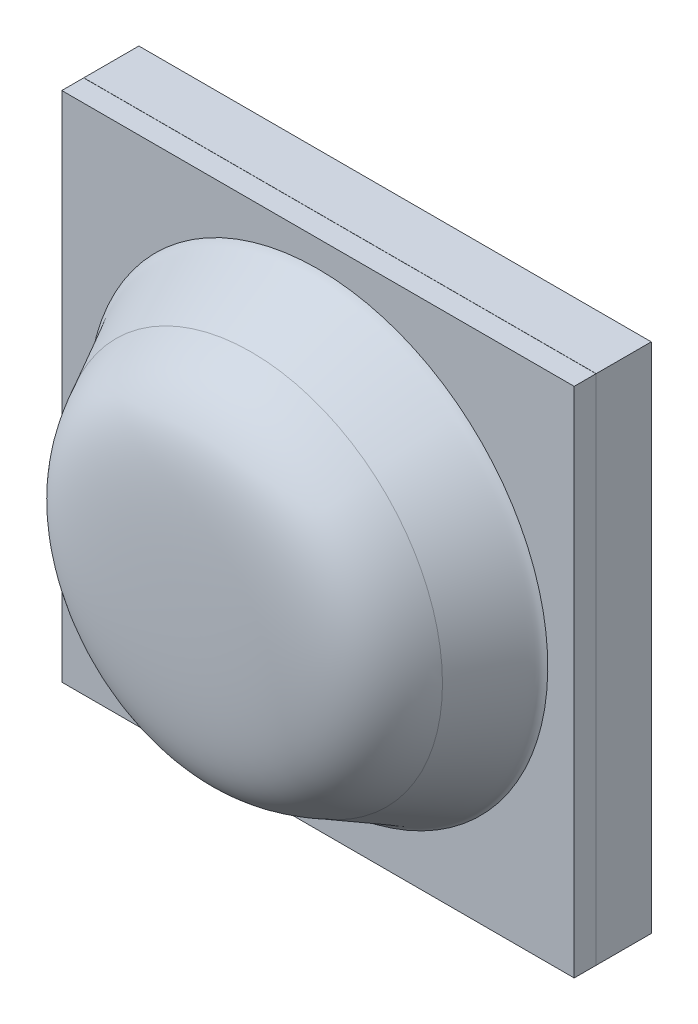
ISO-10303-21;
HEADER;
FILE_DESCRIPTION(('STEP AP214'),'2;1');
FILE_NAME('part.step','',(''),(''),'','','');
FILE_SCHEMA(('AUTOMOTIVE_DESIGN { 1 0 10303 214 1 1 1 1 }'));
ENDSEC;
DATA;
#1=APPLICATION_CONTEXT('core data for automotive mechanical design processes');
#2=APPLICATION_PROTOCOL_DEFINITION('international standard','automotive_design',2000,#1);
#3=PRODUCT_CONTEXT('',#1,'mechanical');
#4=PRODUCT('Part','Part','',(#3));
#5=PRODUCT_RELATED_PRODUCT_CATEGORY('part','',(#4));
#6=PRODUCT_DEFINITION_FORMATION('','',#4);
#7=PRODUCT_DEFINITION_CONTEXT('part definition',#1,'design');
#8=PRODUCT_DEFINITION('design','',#6,#7);
#9=PRODUCT_DEFINITION_SHAPE('','',#8);
#10=(LENGTH_UNIT() NAMED_UNIT(*) SI_UNIT(.MILLI.,.METRE.));
#11=(NAMED_UNIT(*) PLANE_ANGLE_UNIT() SI_UNIT($,.RADIAN.));
#12=(NAMED_UNIT(*) SI_UNIT($,.STERADIAN.) SOLID_ANGLE_UNIT());
#13=UNCERTAINTY_MEASURE_WITH_UNIT(LENGTH_MEASURE(1.E-05),#10,'distance_accuracy_value','');
#14=(GEOMETRIC_REPRESENTATION_CONTEXT(3) GLOBAL_UNCERTAINTY_ASSIGNED_CONTEXT((#13)) GLOBAL_UNIT_ASSIGNED_CONTEXT((#10,
#11,#12)) REPRESENTATION_CONTEXT('',''));
#15=CARTESIAN_POINT('',(0.,0.,0.));
#16=DIRECTION('',(0.,0.,1.));
#17=DIRECTION('',(1.,0.,0.));
#18=AXIS2_PLACEMENT_3D('',#15,#16,#17);
#19=CARTESIAN_POINT('',(0.,0.,1.55299));
#20=CARTESIAN_POINT('',(0.,1.156,1.55299));
#21=CARTESIAN_POINT('',(0.,1.4,1.05299));
#22=(BOUNDED_CURVE() B_SPLINE_CURVE(2,(#19,#20,#21),.UNSPECIFIED.,.F.,
.F.) B_SPLINE_CURVE_WITH_KNOTS((3,3),(-1.,0.),
.UNSPECIFIED.) CURVE() GEOMETRIC_REPRESENTATION_ITEM() RATIONAL_B_SPLINE_CURVE((1.,
1.94117647058824,1.)) REPRESENTATION_ITEM(''));
#23=CARTESIAN_POINT('',(0.,0.,1.55299));
#24=DIRECTION('',(0.,0.,1.));
#25=AXIS1_PLACEMENT('',#23,#24);
#26=SURFACE_OF_REVOLUTION('',#22,#25);
#27=CARTESIAN_POINT('',(0.,0.,1.053));
#28=DIRECTION('',(0.,0.,1.));
#29=DIRECTION('',(0.,1.,0.));
#30=AXIS2_PLACEMENT_3D('',#27,#28,#29);
#31=CIRCLE('',#30,1.4);
#32=CARTESIAN_POINT('',(0.,1.4,1.053));
#33=VERTEX_POINT('',#32);
#34=EDGE_CURVE('E255',#33,#33,#31,.F.);
#35=ORIENTED_EDGE('',*,*,#34,.F.);
#36=EDGE_LOOP('',(#35));
#37=FACE_BOUND('',#36,.T.);
#38=CARTESIAN_POINT('',(0.,0.,1.55299));
#39=VERTEX_POINT('',#38);
#40=VERTEX_LOOP('',#39);
#41=FACE_BOUND('',#40,.T.);
#42=ADVANCED_FACE('F17',(#37,#41),#26,.F.);
#43=CARTESIAN_POINT('',(0.,1.4,1.053));
#44=CARTESIAN_POINT('',(0.,1.65,0.583));
#45=CARTESIAN_POINT('',(0.,1.7,0.553));
#46=(BOUNDED_CURVE() B_SPLINE_CURVE(2,(#43,#44,#45),.UNSPECIFIED.,.F.,
.F.) B_SPLINE_CURVE_WITH_KNOTS((3,3),(-1.,0.),
.UNSPECIFIED.) CURVE() GEOMETRIC_REPRESENTATION_ITEM() RATIONAL_B_SPLINE_CURVE((1.,
7.33333333333333,1.)) REPRESENTATION_ITEM(''));
#47=CARTESIAN_POINT('',(0.,0.,1.053));
#48=DIRECTION('',(0.,0.,1.));
#49=AXIS1_PLACEMENT('',#47,#48);
#50=SURFACE_OF_REVOLUTION('',#46,#49);
#51=ORIENTED_EDGE('',*,*,#34,.T.);
#52=EDGE_LOOP('',(#51));
#53=FACE_BOUND('',#52,.T.);
#54=CARTESIAN_POINT('',(0.,0.,0.564155041236885));
#55=DIRECTION('',(0.,0.,1.));
#56=DIRECTION('',(0.,1.,0.));
#57=AXIS2_PLACEMENT_3D('',#54,#55,#56);
#58=CIRCLE('',#57,1.68189867190232);
#59=CARTESIAN_POINT('',(0.,1.68189867190232,0.564155041236885));
#60=VERTEX_POINT('',#59);
#61=EDGE_CURVE('E222',#60,#60,#58,.T.);
#62=ORIENTED_EDGE('',*,*,#61,.T.);
#63=EDGE_LOOP('',(#62));
#64=FACE_BOUND('',#63,.T.);
#65=ADVANCED_FACE('F101',(#53,#64),#50,.F.);
#66=CARTESIAN_POINT('',(1.875,-1.875,0.564155041236885));
#67=DIRECTION('',(0.,0.,-1.));
#68=DIRECTION('',(-1.,0.,0.));
#69=AXIS2_PLACEMENT_3D('',#66,#67,#68);
#70=PLANE('',#69);
#71=ORIENTED_EDGE('',*,*,#61,.F.);
#72=EDGE_LOOP('',(#71));
#73=FACE_BOUND('',#72,.T.);
#74=DIRECTION('',(0.,1.,0.));
#75=VECTOR('',#74,1.);
#76=CARTESIAN_POINT('',(1.875,1.875,0.564155041236885));
#77=LINE('',#76,#75);
#78=CARTESIAN_POINT('',(1.875,1.875,0.564155041236885));
#79=VERTEX_POINT('',#78);
#80=CARTESIAN_POINT('',(1.875,-1.875,0.564155041236885));
#81=VERTEX_POINT('',#80);
#82=EDGE_CURVE('E207',#79,#81,#77,.F.);
#83=ORIENTED_EDGE('',*,*,#82,.F.);
#84=DIRECTION('',(-1.,0.,0.));
#85=VECTOR('',#84,1.);
#86=CARTESIAN_POINT('',(-1.875,1.875,0.564155041236885));
#87=LINE('',#86,#85);
#88=CARTESIAN_POINT('',(-1.875,1.875,0.564155041236885));
#89=VERTEX_POINT('',#88);
#90=EDGE_CURVE('E213',#89,#79,#87,.F.);
#91=ORIENTED_EDGE('',*,*,#90,.F.);
#92=DIRECTION('',(0.,1.,0.));
#93=VECTOR('',#92,1.);
#94=CARTESIAN_POINT('',(-1.875,1.875,0.564155041236885));
#95=LINE('',#94,#93);
#96=CARTESIAN_POINT('',(-1.875,-1.875,0.564155041236885));
#97=VERTEX_POINT('',#96);
#98=EDGE_CURVE('E96',#97,#89,#95,.T.);
#99=ORIENTED_EDGE('',*,*,#98,.F.);
#100=DIRECTION('',(1.,0.,0.));
#101=VECTOR('',#100,1.);
#102=CARTESIAN_POINT('',(-1.875,-1.875,0.564155041236885));
#103=LINE('',#102,#101);
#104=EDGE_CURVE('E220',#81,#97,#103,.F.);
#105=ORIENTED_EDGE('',*,*,#104,.F.);
#106=EDGE_LOOP('',(#83,#91,#99,#105));
#107=FACE_BOUND('',#106,.T.);
#108=ADVANCED_FACE('F107',(#73,#107),#70,.F.);
#109=CARTESIAN_POINT('',(-1.875,-1.875,0.404155041236885));
#110=DIRECTION('',(0.,-1.,0.));
#111=DIRECTION('',(1.,0.,0.));
#112=AXIS2_PLACEMENT_3D('',#109,#110,#111);
#113=PLANE('',#112);
#114=DIRECTION('',(-1.,0.,0.));
#115=VECTOR('',#114,1.);
#116=CARTESIAN_POINT('',(1.875,-1.875,0.404155041236885));
#117=LINE('',#116,#115);
#118=CARTESIAN_POINT('',(1.875,-1.875,0.404155041236885));
#119=VERTEX_POINT('',#118);
#120=CARTESIAN_POINT('',(-1.875,-1.875,0.404155041236885));
#121=VERTEX_POINT('',#120);
#122=EDGE_CURVE('E203',#119,#121,#117,.T.);
#123=ORIENTED_EDGE('',*,*,#122,.F.);
#124=DIRECTION('',(0.,0.,-1.));
#125=VECTOR('',#124,1.);
#126=CARTESIAN_POINT('',(1.875,-1.875,0.404155041236885));
#127=LINE('',#126,#125);
#128=EDGE_CURVE('E204',#81,#119,#127,.T.);
#129=ORIENTED_EDGE('',*,*,#128,.F.);
#130=ORIENTED_EDGE('',*,*,#104,.T.);
#131=DIRECTION('',(0.,0.,1.));
#132=VECTOR('',#131,1.);
#133=CARTESIAN_POINT('',(-1.875,-1.875,0.404155041236885));
#134=LINE('',#133,#132);
#135=EDGE_CURVE('E216',#121,#97,#134,.T.);
#136=ORIENTED_EDGE('',*,*,#135,.F.);
#137=EDGE_LOOP('',(#123,#129,#130,#136));
#138=FACE_BOUND('',#137,.T.);
#139=ADVANCED_FACE('F243',(#138),#113,.T.);
#140=CARTESIAN_POINT('',(-1.875,1.875,0.404155041236885));
#141=DIRECTION('',(-1.,0.,0.));
#142=DIRECTION('',(0.,0.,1.));
#143=AXIS2_PLACEMENT_3D('',#140,#141,#142);
#144=PLANE('',#143);
#145=DIRECTION('',(0.,1.,0.));
#146=VECTOR('',#145,1.);
#147=CARTESIAN_POINT('',(-1.875,-1.875,0.404155041236885));
#148=LINE('',#147,#146);
#149=CARTESIAN_POINT('',(-1.875,1.875,0.404155041236885));
#150=VERTEX_POINT('',#149);
#151=EDGE_CURVE('E284',#121,#150,#148,.T.);
#152=ORIENTED_EDGE('',*,*,#151,.F.);
#153=ORIENTED_EDGE('',*,*,#135,.T.);
#154=ORIENTED_EDGE('',*,*,#98,.T.);
#155=DIRECTION('',(0.,0.,1.));
#156=VECTOR('',#155,1.);
#157=CARTESIAN_POINT('',(-1.875,1.875,0.404155041236885));
#158=LINE('',#157,#156);
#159=EDGE_CURVE('E210',#150,#89,#158,.T.);
#160=ORIENTED_EDGE('',*,*,#159,.F.);
#161=EDGE_LOOP('',(#152,#153,#154,#160));
#162=FACE_BOUND('',#161,.T.);
#163=ADVANCED_FACE('F258',(#162),#144,.T.);
#164=CARTESIAN_POINT('',(-1.875,1.875,0.404155041236885));
#165=DIRECTION('',(0.,1.,0.));
#166=DIRECTION('',(-1.,0.,0.));
#167=AXIS2_PLACEMENT_3D('',#164,#165,#166);
#168=PLANE('',#167);
#169=DIRECTION('',(-1.,0.,0.));
#170=VECTOR('',#169,1.);
#171=CARTESIAN_POINT('',(1.875,1.875,0.404155041236885));
#172=LINE('',#171,#170);
#173=CARTESIAN_POINT('',(1.875,1.875,0.404155041236885));
#174=VERTEX_POINT('',#173);
#175=EDGE_CURVE('E279',#150,#174,#172,.F.);
#176=ORIENTED_EDGE('',*,*,#175,.F.);
#177=ORIENTED_EDGE('',*,*,#159,.T.);
#178=ORIENTED_EDGE('',*,*,#90,.T.);
#179=DIRECTION('',(0.,0.,-1.));
#180=VECTOR('',#179,1.);
#181=CARTESIAN_POINT('',(1.875,1.875,0.404155041236885));
#182=LINE('',#181,#180);
#183=EDGE_CURVE('E195',#174,#79,#182,.F.);
#184=ORIENTED_EDGE('',*,*,#183,.F.);
#185=EDGE_LOOP('',(#176,#177,#178,#184));
#186=FACE_BOUND('',#185,.T.);
#187=ADVANCED_FACE('F262',(#186),#168,.T.);
#188=CARTESIAN_POINT('',(1.875,1.875,0.404155041236885));
#189=DIRECTION('',(1.,0.,0.));
#190=DIRECTION('',(0.,0.,-1.));
#191=AXIS2_PLACEMENT_3D('',#188,#189,#190);
#192=PLANE('',#191);
#193=DIRECTION('',(0.,1.,0.));
#194=VECTOR('',#193,1.);
#195=CARTESIAN_POINT('',(1.875,-1.875,0.404155041236885));
#196=LINE('',#195,#194);
#197=EDGE_CURVE('E275',#174,#119,#196,.F.);
#198=ORIENTED_EDGE('',*,*,#197,.F.);
#199=ORIENTED_EDGE('',*,*,#183,.T.);
#200=ORIENTED_EDGE('',*,*,#82,.T.);
#201=ORIENTED_EDGE('',*,*,#128,.T.);
#202=EDGE_LOOP('',(#198,#199,#200,#201));
#203=FACE_BOUND('',#202,.T.);
#204=ADVANCED_FACE('F265',(#203),#192,.T.);
#205=CARTESIAN_POINT('',(1.875,-1.875,0.404155041236885));
#206=DIRECTION('',(0.,0.,-1.));
#207=DIRECTION('',(-1.,0.,0.));
#208=AXIS2_PLACEMENT_3D('',#205,#206,#207);
#209=PLANE('',#208);
#210=ORIENTED_EDGE('',*,*,#175,.T.);
#211=ORIENTED_EDGE('',*,*,#197,.T.);
#212=ORIENTED_EDGE('',*,*,#122,.T.);
#213=ORIENTED_EDGE('',*,*,#151,.T.);
#214=EDGE_LOOP('',(#210,#211,#212,#213));
#215=FACE_BOUND('',#214,.T.);
#216=CARTESIAN_POINT('',(1.8,1.8,0.404155041236885));
#217=DIRECTION('',(-1.,0.,0.));
#218=VECTOR('',#217,1.);
#219=LINE('',#216,#218);
#220=CARTESIAN_POINT('',(1.8,1.8,0.403577520618447));
#221=VERTEX_POINT('',#220);
#222=CARTESIAN_POINT('',(-1.8,1.8,0.403577520618446));
#223=VERTEX_POINT('',#222);
#224=EDGE_CURVE('E182',#221,#223,#219,.T.);
#225=ORIENTED_EDGE('',*,*,#224,.T.);
#226=CARTESIAN_POINT('',(-1.8,1.8,0.404155041236885));
#227=DIRECTION('',(0.,-1.,0.));
#228=VECTOR('',#227,1.);
#229=LINE('',#226,#228);
#230=CARTESIAN_POINT('',(-1.8,-1.8,0.403577520618446));
#231=VERTEX_POINT('',#230);
#232=EDGE_CURVE('E169',#223,#231,#229,.T.);
#233=ORIENTED_EDGE('',*,*,#232,.T.);
#234=CARTESIAN_POINT('',(-1.8,-1.8,0.404155041236885));
#235=DIRECTION('',(1.,0.,0.));
#236=VECTOR('',#235,1.);
#237=LINE('',#234,#236);
#238=CARTESIAN_POINT('',(1.8,-1.8,0.403577520618447));
#239=VERTEX_POINT('',#238);
#240=EDGE_CURVE('E290',#231,#239,#237,.T.);
#241=ORIENTED_EDGE('',*,*,#240,.T.);
#242=CARTESIAN_POINT('',(1.8,-1.8,0.404155041236885));
#243=DIRECTION('',(0.,1.,0.));
#244=VECTOR('',#243,1.);
#245=LINE('',#242,#244);
#246=EDGE_CURVE('E289',#239,#221,#245,.T.);
#247=ORIENTED_EDGE('',*,*,#246,.T.);
#248=EDGE_LOOP('',(#225,#233,#241,#247));
#249=FACE_BOUND('',#248,.T.);
#250=ADVANCED_FACE('F137',(#215,#249),#209,.T.);
#251=CARTESIAN_POINT('',(1.562144203303,0.650000000000003,0.403000000000008));
#252=DIRECTION('',(0.,0.,-1.));
#253=DIRECTION('',(-1.,0.,0.));
#254=AXIS2_PLACEMENT_3D('',#251,#252,#253);
#255=PLANE('',#254);
#256=DIRECTION('',(0.,1.,0.));
#257=VECTOR('',#256,1.);
#258=CARTESIAN_POINT('',(1.87500000000002,-1.875,0.403000000000005));
#259=LINE('',#258,#257);
#260=CARTESIAN_POINT('',(1.87500000000002,-1.875,0.403000000000007));
#261=VERTEX_POINT('',#260);
#262=CARTESIAN_POINT('',(1.87500000000002,1.875,0.403000000000007));
#263=VERTEX_POINT('',#262);
#264=EDGE_CURVE('E306',#261,#263,#259,.T.);
#265=ORIENTED_EDGE('',*,*,#264,.T.);
#266=DIRECTION('',(1.,0.,0.));
#267=VECTOR('',#266,1.);
#268=CARTESIAN_POINT('',(-1.87499999999998,1.875,0.403000000000005));
#269=LINE('',#268,#267);
#270=CARTESIAN_POINT('',(-1.87499999999998,1.875,0.403000000000007));
#271=VERTEX_POINT('',#270);
#272=EDGE_CURVE('E292',#263,#271,#269,.F.);
#273=ORIENTED_EDGE('',*,*,#272,.T.);
#274=DIRECTION('',(0.,1.,0.));
#275=VECTOR('',#274,1.);
#276=CARTESIAN_POINT('',(-1.87499999999998,-1.875,0.403000000000005));
#277=LINE('',#276,#275);
#278=CARTESIAN_POINT('',(-1.87499999999998,-1.875,0.403000000000006));
#279=VERTEX_POINT('',#278);
#280=EDGE_CURVE('E291',#271,#279,#277,.F.);
#281=ORIENTED_EDGE('',*,*,#280,.T.);
#282=DIRECTION('',(1.,0.,0.));
#283=VECTOR('',#282,1.);
#284=CARTESIAN_POINT('',(-1.87499999999998,-1.875,0.403000000000005));
#285=LINE('',#284,#283);
#286=EDGE_CURVE('E312',#279,#261,#285,.T.);
#287=ORIENTED_EDGE('',*,*,#286,.T.);
#288=EDGE_LOOP('',(#265,#273,#281,#287));
#289=FACE_BOUND('',#288,.T.);
#290=ORIENTED_EDGE('',*,*,#240,.F.);
#291=ORIENTED_EDGE('',*,*,#232,.F.);
#292=ORIENTED_EDGE('',*,*,#224,.F.);
#293=ORIENTED_EDGE('',*,*,#246,.F.);
#294=EDGE_LOOP('',(#290,#291,#292,#293));
#295=FACE_BOUND('',#294,.T.);
#296=ADVANCED_FACE('F132',(#289,#295),#255,.F.);
#297=CARTESIAN_POINT('',(-1.87499999999998,-1.875,0.403000000000001));
#298=DIRECTION('',(1.,0.,0.));
#299=DIRECTION('',(0.,0.,-1.));
#300=AXIS2_PLACEMENT_3D('',#297,#298,#299);
#301=PLANE('',#300);
#302=DIRECTION('',(0.,0.,1.));
#303=VECTOR('',#302,1.);
#304=CARTESIAN_POINT('',(-1.87499999999998,-1.875,0.403000000000001));
#305=LINE('',#304,#303);
#306=CARTESIAN_POINT('',(-1.87499999999998,-1.875,0.));
#307=VERTEX_POINT('',#306);
#308=EDGE_CURVE('E310',#307,#279,#305,.T.);
#309=ORIENTED_EDGE('',*,*,#308,.T.);
#310=ORIENTED_EDGE('',*,*,#280,.F.);
#311=DIRECTION('',(0.,0.,-1.));
#312=VECTOR('',#311,1.);
#313=CARTESIAN_POINT('',(-1.87499999999998,1.875,0.403000000000001));
#314=LINE('',#313,#312);
#315=CARTESIAN_POINT('',(-1.87499999999998,1.875,0.));
#316=VERTEX_POINT('',#315);
#317=EDGE_CURVE('E302',#271,#316,#314,.T.);
#318=ORIENTED_EDGE('',*,*,#317,.T.);
#319=DIRECTION('',(0.,1.,0.));
#320=VECTOR('',#319,1.);
#321=CARTESIAN_POINT('',(-1.87499999999998,-1.875,0.));
#322=LINE('',#321,#320);
#323=EDGE_CURVE('E315',#307,#316,#322,.T.);
#324=ORIENTED_EDGE('',*,*,#323,.F.);
#325=EDGE_LOOP('',(#309,#310,#318,#324));
#326=FACE_BOUND('',#325,.T.);
#327=ADVANCED_FACE('F128',(#326),#301,.F.);
#328=CARTESIAN_POINT('',(-1.87499999999998,1.875,0.403000000000001));
#329=DIRECTION('',(0.,-1.,0.));
#330=DIRECTION('',(0.,0.,-1.));
#331=AXIS2_PLACEMENT_3D('',#328,#329,#330);
#332=PLANE('',#331);
#333=ORIENTED_EDGE('',*,*,#317,.F.);
#334=ORIENTED_EDGE('',*,*,#272,.F.);
#335=DIRECTION('',(0.,0.,1.));
#336=VECTOR('',#335,1.);
#337=CARTESIAN_POINT('',(1.87500000000002,1.875,0.403000000000001));
#338=LINE('',#337,#336);
#339=CARTESIAN_POINT('',(1.87500000000002,1.875,0.));
#340=VERTEX_POINT('',#339);
#341=EDGE_CURVE('E308',#263,#340,#338,.F.);
#342=ORIENTED_EDGE('',*,*,#341,.T.);
#343=DIRECTION('',(-1.,0.,0.));
#344=VECTOR('',#343,1.);
#345=CARTESIAN_POINT('',(1.87500000000002,1.875,0.));
#346=LINE('',#345,#344);
#347=EDGE_CURVE('E318',#316,#340,#346,.F.);
#348=ORIENTED_EDGE('',*,*,#347,.F.);
#349=EDGE_LOOP('',(#333,#334,#342,#348));
#350=FACE_BOUND('',#349,.T.);
#351=ADVANCED_FACE('F125',(#350),#332,.F.);
#352=CARTESIAN_POINT('',(1.87500000000002,-1.875,0.403000000000001));
#353=DIRECTION('',(-1.,0.,0.));
#354=DIRECTION('',(0.,0.,1.));
#355=AXIS2_PLACEMENT_3D('',#352,#353,#354);
#356=PLANE('',#355);
#357=ORIENTED_EDGE('',*,*,#341,.F.);
#358=ORIENTED_EDGE('',*,*,#264,.F.);
#359=DIRECTION('',(0.,0.,1.));
#360=VECTOR('',#359,1.);
#361=CARTESIAN_POINT('',(1.87500000000002,-1.875,0.403000000000001));
#362=LINE('',#361,#360);
#363=CARTESIAN_POINT('',(1.87500000000002,-1.875,0.));
#364=VERTEX_POINT('',#363);
#365=EDGE_CURVE('E37',#261,#364,#362,.F.);
#366=ORIENTED_EDGE('',*,*,#365,.T.);
#367=DIRECTION('',(0.,1.,0.));
#368=VECTOR('',#367,1.);
#369=CARTESIAN_POINT('',(1.87500000000002,-1.875,0.));
#370=LINE('',#369,#368);
#371=EDGE_CURVE('E28',#340,#364,#370,.F.);
#372=ORIENTED_EDGE('',*,*,#371,.F.);
#373=EDGE_LOOP('',(#357,#358,#366,#372));
#374=FACE_BOUND('',#373,.T.);
#375=ADVANCED_FACE('F118',(#374),#356,.F.);
#376=CARTESIAN_POINT('',(-1.87499999999998,-1.875,0.403000000000001));
#377=DIRECTION('',(0.,1.,0.));
#378=DIRECTION('',(0.,0.,1.));
#379=AXIS2_PLACEMENT_3D('',#376,#377,#378);
#380=PLANE('',#379);
#381=ORIENTED_EDGE('',*,*,#365,.F.);
#382=ORIENTED_EDGE('',*,*,#286,.F.);
#383=ORIENTED_EDGE('',*,*,#308,.F.);
#384=DIRECTION('',(-1.,0.,0.));
#385=VECTOR('',#384,1.);
#386=CARTESIAN_POINT('',(1.87500000000002,-1.875,0.));
#387=LINE('',#386,#385);
#388=EDGE_CURVE('E11',#364,#307,#387,.T.);
#389=ORIENTED_EDGE('',*,*,#388,.F.);
#390=EDGE_LOOP('',(#381,#382,#383,#389));
#391=FACE_BOUND('',#390,.T.);
#392=ADVANCED_FACE('F112',(#391),#380,.F.);
#393=CARTESIAN_POINT('',(1.87500000000002,-1.875,0.));
#394=DIRECTION('',(0.,0.,-1.));
#395=DIRECTION('',(-1.,0.,0.));
#396=AXIS2_PLACEMENT_3D('',#393,#394,#395);
#397=PLANE('',#396);
#398=ORIENTED_EDGE('',*,*,#371,.T.);
#399=ORIENTED_EDGE('',*,*,#388,.T.);
#400=ORIENTED_EDGE('',*,*,#323,.T.);
#401=ORIENTED_EDGE('',*,*,#347,.T.);
#402=EDGE_LOOP('',(#398,#399,#400,#401));
#403=FACE_BOUND('',#402,.T.);
#404=ADVANCED_FACE('F110',(#403),#397,.T.);
#405=CLOSED_SHELL('',(#42,#65,#108,#139,#163,#187,#204,#250,#296,#327,#351,#375,#392,#404));
#406=MANIFOLD_SOLID_BREP('B1',#405);
#407=ADVANCED_BREP_SHAPE_REPRESENTATION('',(#18,#406),#14);
#408=SHAPE_DEFINITION_REPRESENTATION(#9,#407);
ENDSEC;
END-ISO-10303-21;
